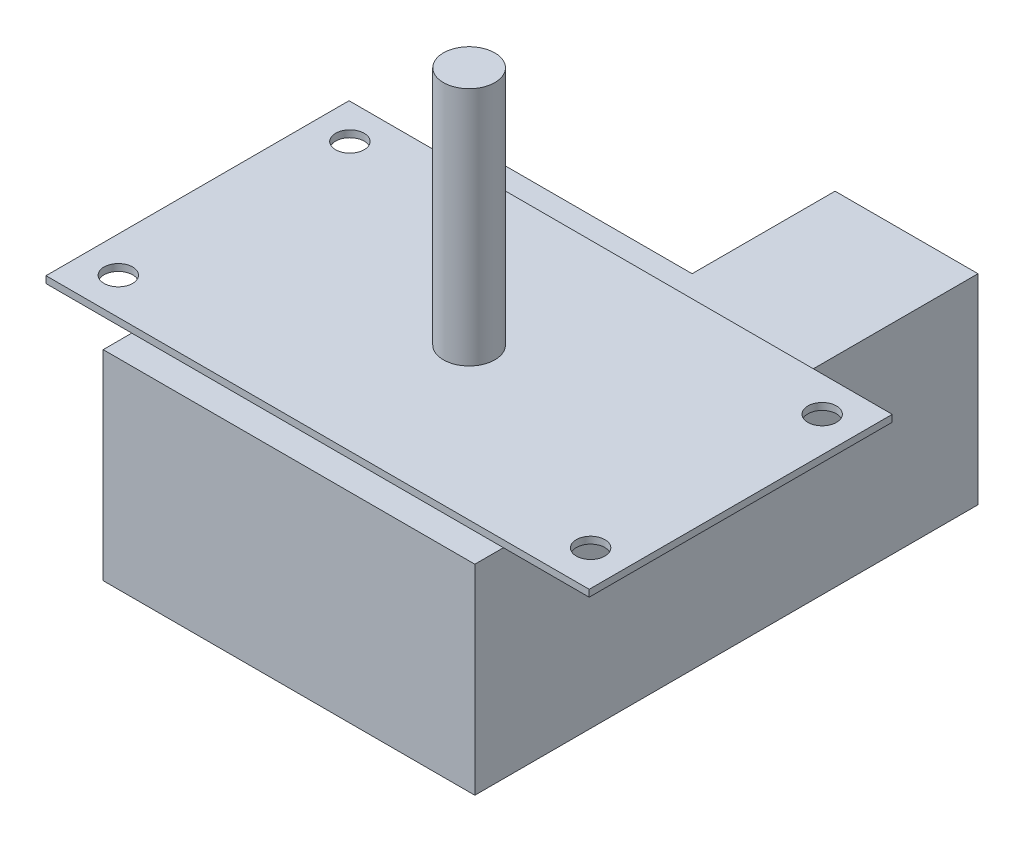
ISO-10303-21;
HEADER;
FILE_DESCRIPTION(('STEP AP214'),'2;1');
FILE_NAME('part.step','',(''),(''),'','','');
FILE_SCHEMA(('AUTOMOTIVE_DESIGN { 1 0 10303 214 1 1 1 1 }'));
ENDSEC;
DATA;
#1=APPLICATION_CONTEXT('core data for automotive mechanical design processes');
#2=APPLICATION_PROTOCOL_DEFINITION('international standard','automotive_design',2000,#1);
#3=PRODUCT_CONTEXT('',#1,'mechanical');
#4=PRODUCT('Part','Part','',(#3));
#5=PRODUCT_RELATED_PRODUCT_CATEGORY('part','',(#4));
#6=PRODUCT_DEFINITION_FORMATION('','',#4);
#7=PRODUCT_DEFINITION_CONTEXT('part definition',#1,'design');
#8=PRODUCT_DEFINITION('design','',#6,#7);
#9=PRODUCT_DEFINITION_SHAPE('','',#8);
#10=(LENGTH_UNIT() NAMED_UNIT(*) SI_UNIT(.MILLI.,.METRE.));
#11=(NAMED_UNIT(*) PLANE_ANGLE_UNIT() SI_UNIT($,.RADIAN.));
#12=(NAMED_UNIT(*) SI_UNIT($,.STERADIAN.) SOLID_ANGLE_UNIT());
#13=UNCERTAINTY_MEASURE_WITH_UNIT(LENGTH_MEASURE(1.E-05),#10,'distance_accuracy_value','');
#14=(GEOMETRIC_REPRESENTATION_CONTEXT(3) GLOBAL_UNCERTAINTY_ASSIGNED_CONTEXT((#13)) GLOBAL_UNIT_ASSIGNED_CONTEXT((#10,
#11,#12)) REPRESENTATION_CONTEXT('',''));
#15=CARTESIAN_POINT('',(0.,0.,0.));
#16=DIRECTION('',(0.,0.,1.));
#17=DIRECTION('',(1.,0.,0.));
#18=AXIS2_PLACEMENT_3D('',#15,#16,#17);
#19=CARTESIAN_POINT('',(0.,0.,0.));
#20=DIRECTION('',(0.,1.,0.));
#21=DIRECTION('',(0.,0.,1.));
#22=AXIS2_PLACEMENT_3D('',#19,#20,#21);
#23=PLANE('',#22);
#24=CARTESIAN_POINT('',(41.35,0.,20.1));
#25=DIRECTION('',(0.,1.,0.));
#26=DIRECTION('',(0.,0.,1.));
#27=AXIS2_PLACEMENT_3D('',#24,#25,#26);
#28=CIRCLE('',#27,2.5);
#29=CARTESIAN_POINT('',(41.35,0.,22.6));
#30=VERTEX_POINT('',#29);
#31=EDGE_CURVE('E166',#30,#30,#28,.F.);
#32=ORIENTED_EDGE('',*,*,#31,.F.);
#33=EDGE_LOOP('',(#32));
#34=FACE_BOUND('',#33,.T.);
#35=CARTESIAN_POINT('',(41.35,0.,-20.4));
#36=DIRECTION('',(0.,1.,0.));
#37=DIRECTION('',(0.,0.,1.));
#38=AXIS2_PLACEMENT_3D('',#35,#36,#37);
#39=CIRCLE('',#38,2.5);
#40=CARTESIAN_POINT('',(41.35,0.,-17.9));
#41=VERTEX_POINT('',#40);
#42=EDGE_CURVE('E180',#41,#41,#39,.F.);
#43=ORIENTED_EDGE('',*,*,#42,.F.);
#44=EDGE_LOOP('',(#43));
#45=FACE_BOUND('',#44,.T.);
#46=DIRECTION('',(0.,0.,1.));
#47=VECTOR('',#46,1.);
#48=CARTESIAN_POINT('',(32.5,0.,31.5));
#49=LINE('',#48,#47);
#50=CARTESIAN_POINT('',(32.5,0.,-26.5));
#51=VERTEX_POINT('',#50);
#52=CARTESIAN_POINT('',(32.5,0.,26.5));
#53=VERTEX_POINT('',#52);
#54=EDGE_CURVE('E11',#51,#53,#49,.T.);
#55=ORIENTED_EDGE('',*,*,#54,.F.);
#56=DIRECTION('',(1.,0.,0.));
#57=VECTOR('',#56,1.);
#58=CARTESIAN_POINT('',(-47.5,0.,-26.5));
#59=LINE('',#58,#57);
#60=CARTESIAN_POINT('',(47.5,0.,-26.5));
#61=VERTEX_POINT('',#60);
#62=EDGE_CURVE('E199',#51,#61,#59,.T.);
#63=ORIENTED_EDGE('',*,*,#62,.T.);
#64=DIRECTION('',(0.,0.,-1.));
#65=VECTOR('',#64,1.);
#66=CARTESIAN_POINT('',(47.5,0.,26.5));
#67=LINE('',#66,#65);
#68=CARTESIAN_POINT('',(47.5,0.,26.5));
#69=VERTEX_POINT('',#68);
#70=EDGE_CURVE('E218',#69,#61,#67,.T.);
#71=ORIENTED_EDGE('',*,*,#70,.F.);
#72=DIRECTION('',(1.,0.,0.));
#73=VECTOR('',#72,1.);
#74=CARTESIAN_POINT('',(-47.5,0.,26.5));
#75=LINE('',#74,#73);
#76=EDGE_CURVE('E59',#53,#69,#75,.T.);
#77=ORIENTED_EDGE('',*,*,#76,.F.);
#78=EDGE_LOOP('',(#55,#63,#71,#77));
#79=FACE_BOUND('',#78,.T.);
#80=ADVANCED_FACE('F39',(#34,#45,#79),#23,.F.);
#81=CARTESIAN_POINT('',(-41.25,0.,-20.4));
#82=DIRECTION('',(0.,1.,0.));
#83=DIRECTION('',(0.,0.,1.));
#84=AXIS2_PLACEMENT_3D('',#81,#82,#83);
#85=CIRCLE('',#84,2.5);
#86=CARTESIAN_POINT('',(-41.25,0.,-17.9));
#87=VERTEX_POINT('',#86);
#88=EDGE_CURVE('E195',#87,#87,#85,.F.);
#89=ORIENTED_EDGE('',*,*,#88,.F.);
#90=EDGE_LOOP('',(#89));
#91=FACE_BOUND('',#90,.T.);
#92=CARTESIAN_POINT('',(-41.25,0.,20.1));
#93=DIRECTION('',(0.,1.,0.));
#94=DIRECTION('',(0.,0.,1.));
#95=AXIS2_PLACEMENT_3D('',#92,#93,#94);
#96=CIRCLE('',#95,2.5);
#97=CARTESIAN_POINT('',(-41.25,0.,22.6));
#98=VERTEX_POINT('',#97);
#99=EDGE_CURVE('E181',#98,#98,#96,.F.);
#100=ORIENTED_EDGE('',*,*,#99,.F.);
#101=EDGE_LOOP('',(#100));
#102=FACE_BOUND('',#101,.T.);
#103=DIRECTION('',(0.,0.,-1.));
#104=VECTOR('',#103,1.);
#105=CARTESIAN_POINT('',(-32.5,0.,-31.5));
#106=LINE('',#105,#104);
#107=CARTESIAN_POINT('',(-32.5,0.,26.5));
#108=VERTEX_POINT('',#107);
#109=CARTESIAN_POINT('',(-32.5,0.,-26.5));
#110=VERTEX_POINT('',#109);
#111=EDGE_CURVE('E49',#108,#110,#106,.T.);
#112=ORIENTED_EDGE('',*,*,#111,.F.);
#113=CARTESIAN_POINT('',(-47.5,0.,26.5));
#114=VERTEX_POINT('',#113);
#115=EDGE_CURVE('E223',#114,#108,#75,.T.);
#116=ORIENTED_EDGE('',*,*,#115,.F.);
#117=DIRECTION('',(0.,0.,-1.));
#118=VECTOR('',#117,1.);
#119=CARTESIAN_POINT('',(-47.5,0.,26.5));
#120=LINE('',#119,#118);
#121=CARTESIAN_POINT('',(-47.5,0.,-26.5));
#122=VERTEX_POINT('',#121);
#123=EDGE_CURVE('E205',#114,#122,#120,.T.);
#124=ORIENTED_EDGE('',*,*,#123,.T.);
#125=EDGE_CURVE('E215',#122,#110,#59,.T.);
#126=ORIENTED_EDGE('',*,*,#125,.T.);
#127=EDGE_LOOP('',(#112,#116,#124,#126));
#128=FACE_BOUND('',#127,.T.);
#129=ADVANCED_FACE('F369',(#91,#102,#128),#23,.F.);
#130=CARTESIAN_POINT('',(-47.5,1.2,-26.5));
#131=DIRECTION('',(0.,0.,-1.));
#132=DIRECTION('',(-1.,0.,0.));
#133=AXIS2_PLACEMENT_3D('',#130,#131,#132);
#134=PLANE('',#133);
#135=ORIENTED_EDGE('',*,*,#125,.F.);
#136=DIRECTION('',(0.,-1.,0.));
#137=VECTOR('',#136,1.);
#138=CARTESIAN_POINT('',(-47.5,1.2,-26.5));
#139=LINE('',#138,#137);
#140=CARTESIAN_POINT('',(-47.5,1.2,-26.5));
#141=VERTEX_POINT('',#140);
#142=EDGE_CURVE('E230',#141,#122,#139,.T.);
#143=ORIENTED_EDGE('',*,*,#142,.F.);
#144=DIRECTION('',(1.,0.,0.));
#145=VECTOR('',#144,1.);
#146=CARTESIAN_POINT('',(-47.5,1.2,-26.5));
#147=LINE('',#146,#145);
#148=CARTESIAN_POINT('',(47.5,1.2,-26.5));
#149=VERTEX_POINT('',#148);
#150=EDGE_CURVE('E200',#141,#149,#147,.T.);
#151=ORIENTED_EDGE('',*,*,#150,.T.);
#152=DIRECTION('',(0.,-1.,0.));
#153=VECTOR('',#152,1.);
#154=CARTESIAN_POINT('',(47.5,1.2,-26.5));
#155=LINE('',#154,#153);
#156=EDGE_CURVE('E43',#149,#61,#155,.T.);
#157=ORIENTED_EDGE('',*,*,#156,.T.);
#158=ORIENTED_EDGE('',*,*,#62,.F.);
#159=EDGE_CURVE('E219',#110,#51,#59,.T.);
#160=ORIENTED_EDGE('',*,*,#159,.F.);
#161=EDGE_LOOP('',(#135,#143,#151,#157,#158,#160));
#162=FACE_BOUND('',#161,.T.);
#163=ADVANCED_FACE('F41',(#162),#134,.T.);
#164=CARTESIAN_POINT('',(-47.5,1.2,26.5));
#165=DIRECTION('',(-1.,0.,0.));
#166=DIRECTION('',(0.,0.,1.));
#167=AXIS2_PLACEMENT_3D('',#164,#165,#166);
#168=PLANE('',#167);
#169=ORIENTED_EDGE('',*,*,#123,.F.);
#170=DIRECTION('',(0.,-1.,0.));
#171=VECTOR('',#170,1.);
#172=CARTESIAN_POINT('',(-47.5,1.2,26.5));
#173=LINE('',#172,#171);
#174=CARTESIAN_POINT('',(-47.5,1.2,26.5));
#175=VERTEX_POINT('',#174);
#176=EDGE_CURVE('E233',#175,#114,#173,.T.);
#177=ORIENTED_EDGE('',*,*,#176,.F.);
#178=DIRECTION('',(0.,0.,-1.));
#179=VECTOR('',#178,1.);
#180=CARTESIAN_POINT('',(-47.5,1.2,26.5));
#181=LINE('',#180,#179);
#182=EDGE_CURVE('E211',#175,#141,#181,.T.);
#183=ORIENTED_EDGE('',*,*,#182,.T.);
#184=ORIENTED_EDGE('',*,*,#142,.T.);
#185=EDGE_LOOP('',(#169,#177,#183,#184));
#186=FACE_BOUND('',#185,.T.);
#187=ADVANCED_FACE('F347',(#186),#168,.T.);
#188=CARTESIAN_POINT('',(-47.5,1.2,26.5));
#189=DIRECTION('',(0.,0.,-1.));
#190=DIRECTION('',(-1.,0.,0.));
#191=AXIS2_PLACEMENT_3D('',#188,#189,#190);
#192=PLANE('',#191);
#193=ORIENTED_EDGE('',*,*,#115,.T.);
#194=EDGE_CURVE('E226',#108,#53,#75,.T.);
#195=ORIENTED_EDGE('',*,*,#194,.T.);
#196=ORIENTED_EDGE('',*,*,#76,.T.);
#197=DIRECTION('',(0.,-1.,0.));
#198=VECTOR('',#197,1.);
#199=CARTESIAN_POINT('',(47.5,1.2,26.5));
#200=LINE('',#199,#198);
#201=CARTESIAN_POINT('',(47.5,1.2,26.5));
#202=VERTEX_POINT('',#201);
#203=EDGE_CURVE('E235',#202,#69,#200,.T.);
#204=ORIENTED_EDGE('',*,*,#203,.F.);
#205=DIRECTION('',(1.,0.,0.));
#206=VECTOR('',#205,1.);
#207=CARTESIAN_POINT('',(-47.5,1.2,26.5));
#208=LINE('',#207,#206);
#209=EDGE_CURVE('E208',#175,#202,#208,.T.);
#210=ORIENTED_EDGE('',*,*,#209,.F.);
#211=ORIENTED_EDGE('',*,*,#176,.T.);
#212=EDGE_LOOP('',(#193,#195,#196,#204,#210,#211));
#213=FACE_BOUND('',#212,.T.);
#214=ADVANCED_FACE('F350',(#213),#192,.F.);
#215=CARTESIAN_POINT('',(47.5,1.2,26.5));
#216=DIRECTION('',(-1.,0.,0.));
#217=DIRECTION('',(0.,0.,1.));
#218=AXIS2_PLACEMENT_3D('',#215,#216,#217);
#219=PLANE('',#218);
#220=ORIENTED_EDGE('',*,*,#70,.T.);
#221=ORIENTED_EDGE('',*,*,#156,.F.);
#222=DIRECTION('',(0.,0.,-1.));
#223=VECTOR('',#222,1.);
#224=CARTESIAN_POINT('',(47.5,1.2,26.5));
#225=LINE('',#224,#223);
#226=EDGE_CURVE('E204',#202,#149,#225,.T.);
#227=ORIENTED_EDGE('',*,*,#226,.F.);
#228=ORIENTED_EDGE('',*,*,#203,.T.);
#229=EDGE_LOOP('',(#220,#221,#227,#228));
#230=FACE_BOUND('',#229,.T.);
#231=ADVANCED_FACE('F250',(#230),#219,.F.);
#232=CARTESIAN_POINT('',(0.,1.2,0.));
#233=DIRECTION('',(0.,1.,0.));
#234=DIRECTION('',(0.,0.,1.));
#235=AXIS2_PLACEMENT_3D('',#232,#233,#234);
#236=PLANE('',#235);
#237=CARTESIAN_POINT('',(0.,1.2,0.));
#238=DIRECTION('',(0.,1.,0.));
#239=DIRECTION('',(0.,0.,1.));
#240=AXIS2_PLACEMENT_3D('',#237,#238,#239);
#241=CIRCLE('',#240,4.5);
#242=CARTESIAN_POINT('',(0.,1.2,-4.5));
#243=VERTEX_POINT('',#242);
#244=EDGE_CURVE('E315',#243,#243,#241,.T.);
#245=ORIENTED_EDGE('',*,*,#244,.F.);
#246=EDGE_LOOP('',(#245));
#247=FACE_BOUND('',#246,.T.);
#248=CARTESIAN_POINT('',(41.35,1.2,-20.4));
#249=DIRECTION('',(0.,1.,0.));
#250=DIRECTION('',(0.,0.,1.));
#251=AXIS2_PLACEMENT_3D('',#248,#249,#250);
#252=CIRCLE('',#251,2.5);
#253=CARTESIAN_POINT('',(41.35,1.2,-17.9));
#254=VERTEX_POINT('',#253);
#255=EDGE_CURVE('E176',#254,#254,#252,.T.);
#256=ORIENTED_EDGE('',*,*,#255,.F.);
#257=EDGE_LOOP('',(#256));
#258=FACE_BOUND('',#257,.T.);
#259=CARTESIAN_POINT('',(-41.25,1.2,20.1));
#260=DIRECTION('',(0.,1.,0.));
#261=DIRECTION('',(0.,0.,1.));
#262=AXIS2_PLACEMENT_3D('',#259,#260,#261);
#263=CIRCLE('',#262,2.5);
#264=CARTESIAN_POINT('',(-41.25,1.2,22.6));
#265=VERTEX_POINT('',#264);
#266=EDGE_CURVE('E175',#265,#265,#263,.T.);
#267=ORIENTED_EDGE('',*,*,#266,.F.);
#268=EDGE_LOOP('',(#267));
#269=FACE_BOUND('',#268,.T.);
#270=CARTESIAN_POINT('',(41.35,1.2,20.1));
#271=DIRECTION('',(0.,1.,0.));
#272=DIRECTION('',(0.,0.,1.));
#273=AXIS2_PLACEMENT_3D('',#270,#271,#272);
#274=CIRCLE('',#273,2.5);
#275=CARTESIAN_POINT('',(41.35,1.2,22.6));
#276=VERTEX_POINT('',#275);
#277=EDGE_CURVE('E161',#276,#276,#274,.T.);
#278=ORIENTED_EDGE('',*,*,#277,.F.);
#279=EDGE_LOOP('',(#278));
#280=FACE_BOUND('',#279,.T.);
#281=CARTESIAN_POINT('',(-41.25,1.2,-20.4));
#282=DIRECTION('',(0.,1.,0.));
#283=DIRECTION('',(0.,0.,1.));
#284=AXIS2_PLACEMENT_3D('',#281,#282,#283);
#285=CIRCLE('',#284,2.5);
#286=CARTESIAN_POINT('',(-41.25,1.2,-17.9));
#287=VERTEX_POINT('',#286);
#288=EDGE_CURVE('E185',#287,#287,#285,.T.);
#289=ORIENTED_EDGE('',*,*,#288,.F.);
#290=EDGE_LOOP('',(#289));
#291=FACE_BOUND('',#290,.T.);
#292=ORIENTED_EDGE('',*,*,#150,.F.);
#293=ORIENTED_EDGE('',*,*,#182,.F.);
#294=ORIENTED_EDGE('',*,*,#209,.T.);
#295=ORIENTED_EDGE('',*,*,#226,.T.);
#296=EDGE_LOOP('',(#292,#293,#294,#295));
#297=FACE_BOUND('',#296,.T.);
#298=ADVANCED_FACE('F331',(#247,#258,#269,#280,#291,#297),#236,.T.);
#299=CARTESIAN_POINT('',(-41.25,-0.000999999999999916,-20.4));
#300=DIRECTION('',(0.,1.,0.));
#301=DIRECTION('',(0.,0.,1.));
#302=AXIS2_PLACEMENT_3D('',#299,#300,#301);
#303=CYLINDRICAL_SURFACE('',#302,2.5);
#304=ORIENTED_EDGE('',*,*,#288,.T.);
#305=EDGE_LOOP('',(#304));
#306=FACE_BOUND('',#305,.T.);
#307=ORIENTED_EDGE('',*,*,#88,.T.);
#308=EDGE_LOOP('',(#307));
#309=FACE_BOUND('',#308,.T.);
#310=ADVANCED_FACE('F334',(#306,#309),#303,.F.);
#311=CARTESIAN_POINT('',(41.35,-0.000999999999999916,20.1));
#312=DIRECTION('',(0.,1.,0.));
#313=DIRECTION('',(0.,0.,1.));
#314=AXIS2_PLACEMENT_3D('',#311,#312,#313);
#315=CYLINDRICAL_SURFACE('',#314,2.5);
#316=ORIENTED_EDGE('',*,*,#277,.T.);
#317=EDGE_LOOP('',(#316));
#318=FACE_BOUND('',#317,.T.);
#319=ORIENTED_EDGE('',*,*,#31,.T.);
#320=EDGE_LOOP('',(#319));
#321=FACE_BOUND('',#320,.T.);
#322=ADVANCED_FACE('F401',(#318,#321),#315,.F.);
#323=CARTESIAN_POINT('',(-41.25,-0.000999999999999916,20.1));
#324=DIRECTION('',(0.,1.,0.));
#325=DIRECTION('',(0.,0.,1.));
#326=AXIS2_PLACEMENT_3D('',#323,#324,#325);
#327=CYLINDRICAL_SURFACE('',#326,2.5);
#328=ORIENTED_EDGE('',*,*,#266,.T.);
#329=EDGE_LOOP('',(#328));
#330=FACE_BOUND('',#329,.T.);
#331=ORIENTED_EDGE('',*,*,#99,.T.);
#332=EDGE_LOOP('',(#331));
#333=FACE_BOUND('',#332,.T.);
#334=ADVANCED_FACE('F408',(#330,#333),#327,.F.);
#335=CARTESIAN_POINT('',(41.35,-0.000999999999999916,-20.4));
#336=DIRECTION('',(0.,1.,0.));
#337=DIRECTION('',(0.,0.,1.));
#338=AXIS2_PLACEMENT_3D('',#335,#336,#337);
#339=CYLINDRICAL_SURFACE('',#338,2.5);
#340=ORIENTED_EDGE('',*,*,#255,.T.);
#341=EDGE_LOOP('',(#340));
#342=FACE_BOUND('',#341,.T.);
#343=ORIENTED_EDGE('',*,*,#42,.T.);
#344=EDGE_LOOP('',(#343));
#345=FACE_BOUND('',#344,.T.);
#346=ADVANCED_FACE('F416',(#342,#345),#339,.F.);
#347=CARTESIAN_POINT('',(0.,0.,0.));
#348=DIRECTION('',(0.,1.,0.));
#349=DIRECTION('',(0.,0.,1.));
#350=AXIS2_PLACEMENT_3D('',#347,#348,#349);
#351=PLANE('',#350);
#352=ORIENTED_EDGE('',*,*,#194,.F.);
#353=CARTESIAN_POINT('',(-32.5,0.,31.5));
#354=VERTEX_POINT('',#353);
#355=EDGE_CURVE('E270',#354,#108,#106,.T.);
#356=ORIENTED_EDGE('',*,*,#355,.F.);
#357=DIRECTION('',(-1.,0.,0.));
#358=VECTOR('',#357,1.);
#359=CARTESIAN_POINT('',(-32.5,0.,31.5));
#360=LINE('',#359,#358);
#361=CARTESIAN_POINT('',(32.5,0.,31.5));
#362=VERTEX_POINT('',#361);
#363=EDGE_CURVE('E262',#362,#354,#360,.T.);
#364=ORIENTED_EDGE('',*,*,#363,.F.);
#365=EDGE_CURVE('E52',#53,#362,#49,.T.);
#366=ORIENTED_EDGE('',*,*,#365,.F.);
#367=EDGE_LOOP('',(#352,#356,#364,#366));
#368=FACE_BOUND('',#367,.T.);
#369=ADVANCED_FACE('F356',(#368),#351,.T.);
#370=CARTESIAN_POINT('',(32.5,-35.,31.5));
#371=DIRECTION('',(-1.,0.,0.));
#372=DIRECTION('',(0.,0.,1.));
#373=AXIS2_PLACEMENT_3D('',#370,#371,#372);
#374=PLANE('',#373);
#375=CARTESIAN_POINT('',(32.5,0.,-56.5));
#376=VERTEX_POINT('',#375);
#377=EDGE_CURVE('E51',#376,#51,#49,.T.);
#378=ORIENTED_EDGE('',*,*,#377,.T.);
#379=ORIENTED_EDGE('',*,*,#54,.T.);
#380=ORIENTED_EDGE('',*,*,#365,.T.);
#381=DIRECTION('',(0.,1.,0.));
#382=VECTOR('',#381,1.);
#383=CARTESIAN_POINT('',(32.5,-35.,31.5));
#384=LINE('',#383,#382);
#385=CARTESIAN_POINT('',(32.5,-35.,31.5));
#386=VERTEX_POINT('',#385);
#387=EDGE_CURVE('E137',#386,#362,#384,.T.);
#388=ORIENTED_EDGE('',*,*,#387,.F.);
#389=DIRECTION('',(0.,0.,1.));
#390=VECTOR('',#389,1.);
#391=CARTESIAN_POINT('',(32.5,-35.,31.5));
#392=LINE('',#391,#390);
#393=CARTESIAN_POINT('',(32.5,-35.,-56.5));
#394=VERTEX_POINT('',#393);
#395=EDGE_CURVE('E144',#394,#386,#392,.T.);
#396=ORIENTED_EDGE('',*,*,#395,.F.);
#397=DIRECTION('',(0.,1.,0.));
#398=VECTOR('',#397,1.);
#399=CARTESIAN_POINT('',(32.5,-35.,-56.5));
#400=LINE('',#399,#398);
#401=EDGE_CURVE('E260',#394,#376,#400,.T.);
#402=ORIENTED_EDGE('',*,*,#401,.T.);
#403=EDGE_LOOP('',(#378,#379,#380,#388,#396,#402));
#404=FACE_BOUND('',#403,.T.);
#405=ADVANCED_FACE('F157',(#404),#374,.F.);
#406=CARTESIAN_POINT('',(-32.5,-35.,31.5));
#407=DIRECTION('',(0.,0.,-1.));
#408=DIRECTION('',(-1.,0.,0.));
#409=AXIS2_PLACEMENT_3D('',#406,#407,#408);
#410=PLANE('',#409);
#411=ORIENTED_EDGE('',*,*,#363,.T.);
#412=DIRECTION('',(0.,1.,0.));
#413=VECTOR('',#412,1.);
#414=CARTESIAN_POINT('',(-32.5,-35.,31.5));
#415=LINE('',#414,#413);
#416=CARTESIAN_POINT('',(-32.5,-35.,31.5));
#417=VERTEX_POINT('',#416);
#418=EDGE_CURVE('E139',#417,#354,#415,.T.);
#419=ORIENTED_EDGE('',*,*,#418,.F.);
#420=DIRECTION('',(-1.,0.,0.));
#421=VECTOR('',#420,1.);
#422=CARTESIAN_POINT('',(-32.5,-35.,31.5));
#423=LINE('',#422,#421);
#424=EDGE_CURVE('E133',#386,#417,#423,.T.);
#425=ORIENTED_EDGE('',*,*,#424,.F.);
#426=ORIENTED_EDGE('',*,*,#387,.T.);
#427=EDGE_LOOP('',(#411,#419,#425,#426));
#428=FACE_BOUND('',#427,.T.);
#429=ADVANCED_FACE('F135',(#428),#410,.F.);
#430=CARTESIAN_POINT('',(-32.5,-35.,-31.5));
#431=DIRECTION('',(1.,0.,0.));
#432=DIRECTION('',(0.,0.,-1.));
#433=AXIS2_PLACEMENT_3D('',#430,#431,#432);
#434=PLANE('',#433);
#435=ORIENTED_EDGE('',*,*,#355,.T.);
#436=ORIENTED_EDGE('',*,*,#111,.T.);
#437=CARTESIAN_POINT('',(-32.5,0.,-31.5));
#438=VERTEX_POINT('',#437);
#439=EDGE_CURVE('E259',#110,#438,#106,.T.);
#440=ORIENTED_EDGE('',*,*,#439,.T.);
#441=DIRECTION('',(0.,1.,0.));
#442=VECTOR('',#441,1.);
#443=CARTESIAN_POINT('',(-32.5,-35.,-31.5));
#444=LINE('',#443,#442);
#445=CARTESIAN_POINT('',(-32.5,-35.,-31.5));
#446=VERTEX_POINT('',#445);
#447=EDGE_CURVE('E168',#446,#438,#444,.T.);
#448=ORIENTED_EDGE('',*,*,#447,.F.);
#449=DIRECTION('',(0.,0.,-1.));
#450=VECTOR('',#449,1.);
#451=CARTESIAN_POINT('',(-32.5,-35.,-31.5));
#452=LINE('',#451,#450);
#453=EDGE_CURVE('E143',#417,#446,#452,.T.);
#454=ORIENTED_EDGE('',*,*,#453,.F.);
#455=ORIENTED_EDGE('',*,*,#418,.T.);
#456=EDGE_LOOP('',(#435,#436,#440,#448,#454,#455));
#457=FACE_BOUND('',#456,.T.);
#458=ADVANCED_FACE('F357',(#457),#434,.F.);
#459=CARTESIAN_POINT('',(7.49999999999999,-35.,-31.5));
#460=DIRECTION('',(0.,0.,1.));
#461=DIRECTION('',(1.,0.,0.));
#462=AXIS2_PLACEMENT_3D('',#459,#460,#461);
#463=PLANE('',#462);
#464=DIRECTION('',(1.,0.,0.));
#465=VECTOR('',#464,1.);
#466=CARTESIAN_POINT('',(7.49999999999999,0.,-31.5));
#467=LINE('',#466,#465);
#468=CARTESIAN_POINT('',(7.49999999999999,0.,-31.5));
#469=VERTEX_POINT('',#468);
#470=EDGE_CURVE('E274',#438,#469,#467,.T.);
#471=ORIENTED_EDGE('',*,*,#470,.T.);
#472=DIRECTION('',(0.,1.,0.));
#473=VECTOR('',#472,1.);
#474=CARTESIAN_POINT('',(7.49999999999999,-35.,-31.5));
#475=LINE('',#474,#473);
#476=CARTESIAN_POINT('',(7.49999999999999,-35.,-31.5));
#477=VERTEX_POINT('',#476);
#478=EDGE_CURVE('E288',#477,#469,#475,.T.);
#479=ORIENTED_EDGE('',*,*,#478,.F.);
#480=DIRECTION('',(1.,0.,0.));
#481=VECTOR('',#480,1.);
#482=CARTESIAN_POINT('',(7.49999999999999,-35.,-31.5));
#483=LINE('',#482,#481);
#484=EDGE_CURVE('E298',#446,#477,#483,.T.);
#485=ORIENTED_EDGE('',*,*,#484,.F.);
#486=ORIENTED_EDGE('',*,*,#447,.T.);
#487=EDGE_LOOP('',(#471,#479,#485,#486));
#488=FACE_BOUND('',#487,.T.);
#489=ADVANCED_FACE('F296',(#488),#463,.F.);
#490=CARTESIAN_POINT('',(7.49999999999999,-35.,-56.5));
#491=DIRECTION('',(1.,0.,0.));
#492=DIRECTION('',(0.,0.,-1.));
#493=AXIS2_PLACEMENT_3D('',#490,#491,#492);
#494=PLANE('',#493);
#495=DIRECTION('',(0.,0.,-1.));
#496=VECTOR('',#495,1.);
#497=CARTESIAN_POINT('',(7.49999999999999,0.,-56.5));
#498=LINE('',#497,#496);
#499=CARTESIAN_POINT('',(7.49999999999999,0.,-56.5));
#500=VERTEX_POINT('',#499);
#501=EDGE_CURVE('E277',#469,#500,#498,.T.);
#502=ORIENTED_EDGE('',*,*,#501,.T.);
#503=DIRECTION('',(0.,1.,0.));
#504=VECTOR('',#503,1.);
#505=CARTESIAN_POINT('',(7.49999999999999,-35.,-56.5));
#506=LINE('',#505,#504);
#507=CARTESIAN_POINT('',(7.49999999999999,-35.,-56.5));
#508=VERTEX_POINT('',#507);
#509=EDGE_CURVE('E284',#508,#500,#506,.T.);
#510=ORIENTED_EDGE('',*,*,#509,.F.);
#511=DIRECTION('',(0.,0.,-1.));
#512=VECTOR('',#511,1.);
#513=CARTESIAN_POINT('',(7.49999999999999,-35.,-56.5));
#514=LINE('',#513,#512);
#515=EDGE_CURVE('E308',#477,#508,#514,.T.);
#516=ORIENTED_EDGE('',*,*,#515,.F.);
#517=ORIENTED_EDGE('',*,*,#478,.T.);
#518=EDGE_LOOP('',(#502,#510,#516,#517));
#519=FACE_BOUND('',#518,.T.);
#520=ADVANCED_FACE('F303',(#519),#494,.F.);
#521=CARTESIAN_POINT('',(32.5,-35.,-56.5));
#522=DIRECTION('',(0.,0.,1.));
#523=DIRECTION('',(1.,0.,0.));
#524=AXIS2_PLACEMENT_3D('',#521,#522,#523);
#525=PLANE('',#524);
#526=DIRECTION('',(1.,0.,0.));
#527=VECTOR('',#526,1.);
#528=CARTESIAN_POINT('',(32.5,0.,-56.5));
#529=LINE('',#528,#527);
#530=EDGE_CURVE('E154',#500,#376,#529,.T.);
#531=ORIENTED_EDGE('',*,*,#530,.T.);
#532=ORIENTED_EDGE('',*,*,#401,.F.);
#533=DIRECTION('',(1.,0.,0.));
#534=VECTOR('',#533,1.);
#535=CARTESIAN_POINT('',(32.5,-35.,-56.5));
#536=LINE('',#535,#534);
#537=EDGE_CURVE('E149',#508,#394,#536,.T.);
#538=ORIENTED_EDGE('',*,*,#537,.F.);
#539=ORIENTED_EDGE('',*,*,#509,.T.);
#540=EDGE_LOOP('',(#531,#532,#538,#539));
#541=FACE_BOUND('',#540,.T.);
#542=ADVANCED_FACE('F306',(#541),#525,.F.);
#543=CARTESIAN_POINT('',(0.,-35.,0.));
#544=DIRECTION('',(0.,1.,0.));
#545=DIRECTION('',(0.,0.,1.));
#546=AXIS2_PLACEMENT_3D('',#543,#544,#545);
#547=PLANE('',#546);
#548=ORIENTED_EDGE('',*,*,#395,.T.);
#549=ORIENTED_EDGE('',*,*,#424,.T.);
#550=ORIENTED_EDGE('',*,*,#453,.T.);
#551=ORIENTED_EDGE('',*,*,#484,.T.);
#552=ORIENTED_EDGE('',*,*,#515,.T.);
#553=ORIENTED_EDGE('',*,*,#537,.T.);
#554=EDGE_LOOP('',(#548,#549,#550,#551,#552,#553));
#555=FACE_BOUND('',#554,.T.);
#556=ADVANCED_FACE('F147',(#555),#547,.F.);
#557=ORIENTED_EDGE('',*,*,#439,.F.);
#558=ORIENTED_EDGE('',*,*,#159,.T.);
#559=ORIENTED_EDGE('',*,*,#377,.F.);
#560=ORIENTED_EDGE('',*,*,#530,.F.);
#561=ORIENTED_EDGE('',*,*,#501,.F.);
#562=ORIENTED_EDGE('',*,*,#470,.F.);
#563=EDGE_LOOP('',(#557,#558,#559,#560,#561,#562));
#564=FACE_BOUND('',#563,.T.);
#565=ADVANCED_FACE('F256',(#564),#351,.T.);
#566=CARTESIAN_POINT('',(0.,43.2,0.));
#567=DIRECTION('',(0.,-1.,0.));
#568=DIRECTION('',(0.,0.,-1.));
#569=AXIS2_PLACEMENT_3D('',#566,#567,#568);
#570=CYLINDRICAL_SURFACE('',#569,4.5);
#571=CARTESIAN_POINT('',(0.,43.2,0.));
#572=DIRECTION('',(0.,1.,0.));
#573=DIRECTION('',(0.,0.,1.));
#574=AXIS2_PLACEMENT_3D('',#571,#572,#573);
#575=CIRCLE('',#574,4.5);
#576=CARTESIAN_POINT('',(0.,43.2,-4.5));
#577=VERTEX_POINT('',#576);
#578=EDGE_CURVE('E266',#577,#577,#575,.T.);
#579=CARTESIAN_POINT('',(0.,43.2,-4.5));
#580=CARTESIAN_POINT('',(0.,42.7625,-4.5));
#581=CARTESIAN_POINT('',(0.,42.325,-4.5));
#582=CARTESIAN_POINT('',(0.,41.45,-4.5));
#583=CARTESIAN_POINT('',(0.,41.0125,-4.5));
#584=CARTESIAN_POINT('',(0.,40.1375,-4.5));
#585=CARTESIAN_POINT('',(0.,39.7,-4.5));
#586=CARTESIAN_POINT('',(0.,38.825,-4.5));
#587=CARTESIAN_POINT('',(0.,38.3875,-4.5));
#588=CARTESIAN_POINT('',(0.,37.5125,-4.5));
#589=CARTESIAN_POINT('',(0.,37.075,-4.5));
#590=CARTESIAN_POINT('',(0.,36.2,-4.5));
#591=CARTESIAN_POINT('',(0.,35.7625,-4.5));
#592=CARTESIAN_POINT('',(0.,34.8875,-4.5));
#593=CARTESIAN_POINT('',(0.,34.45,-4.5));
#594=CARTESIAN_POINT('',(0.,33.575,-4.5));
#595=CARTESIAN_POINT('',(0.,33.1375,-4.5));
#596=CARTESIAN_POINT('',(0.,32.2625,-4.5));
#597=CARTESIAN_POINT('',(0.,31.825,-4.5));
#598=CARTESIAN_POINT('',(0.,30.95,-4.5));
#599=CARTESIAN_POINT('',(0.,30.5125,-4.5));
#600=CARTESIAN_POINT('',(0.,29.6375,-4.5));
#601=CARTESIAN_POINT('',(0.,29.2,-4.5));
#602=CARTESIAN_POINT('',(0.,28.325,-4.5));
#603=CARTESIAN_POINT('',(0.,27.8875,-4.5));
#604=CARTESIAN_POINT('',(0.,27.0125,-4.5));
#605=CARTESIAN_POINT('',(0.,26.575,-4.5));
#606=CARTESIAN_POINT('',(0.,25.7,-4.5));
#607=CARTESIAN_POINT('',(0.,25.2625,-4.5));
#608=CARTESIAN_POINT('',(0.,24.3875,-4.5));
#609=CARTESIAN_POINT('',(0.,23.95,-4.5));
#610=CARTESIAN_POINT('',(0.,23.075,-4.5));
#611=CARTESIAN_POINT('',(0.,22.6375,-4.5));
#612=CARTESIAN_POINT('',(0.,21.7625,-4.5));
#613=CARTESIAN_POINT('',(0.,21.325,-4.5));
#614=CARTESIAN_POINT('',(0.,20.45,-4.5));
#615=CARTESIAN_POINT('',(0.,20.0125,-4.5));
#616=CARTESIAN_POINT('',(0.,19.1375,-4.5));
#617=CARTESIAN_POINT('',(0.,18.7,-4.5));
#618=CARTESIAN_POINT('',(0.,17.825,-4.5));
#619=CARTESIAN_POINT('',(0.,17.3875,-4.5));
#620=CARTESIAN_POINT('',(0.,16.5125,-4.5));
#621=CARTESIAN_POINT('',(0.,16.075,-4.5));
#622=CARTESIAN_POINT('',(0.,15.2,-4.5));
#623=CARTESIAN_POINT('',(0.,14.7625,-4.5));
#624=CARTESIAN_POINT('',(0.,13.8875,-4.5));
#625=CARTESIAN_POINT('',(0.,13.45,-4.5));
#626=CARTESIAN_POINT('',(0.,12.575,-4.5));
#627=CARTESIAN_POINT('',(0.,12.1375,-4.5));
#628=CARTESIAN_POINT('',(0.,11.2625,-4.5));
#629=CARTESIAN_POINT('',(0.,10.825,-4.5));
#630=CARTESIAN_POINT('',(0.,9.95,-4.5));
#631=CARTESIAN_POINT('',(0.,9.5125,-4.5));
#632=CARTESIAN_POINT('',(0.,8.6375,-4.5));
#633=CARTESIAN_POINT('',(0.,8.2,-4.5));
#634=CARTESIAN_POINT('',(0.,7.325,-4.5));
#635=CARTESIAN_POINT('',(0.,6.8875,-4.5));
#636=CARTESIAN_POINT('',(0.,6.0125,-4.5));
#637=CARTESIAN_POINT('',(0.,5.575,-4.5));
#638=CARTESIAN_POINT('',(0.,4.7,-4.5));
#639=CARTESIAN_POINT('',(0.,4.2625,-4.5));
#640=CARTESIAN_POINT('',(0.,3.3875,-4.5));
#641=CARTESIAN_POINT('',(0.,2.95,-4.5));
#642=CARTESIAN_POINT('',(0.,2.075,-4.5));
#643=CARTESIAN_POINT('',(0.,1.6375,-4.5));
#644=CARTESIAN_POINT('',(0.,1.2,-4.5));
#645=B_SPLINE_CURVE_WITH_KNOTS('',3,(#579,#580,#581,#582,#583,#584,#585,#586,#587,#588,#589,
#590,#591,#592,#593,#594,#595,#596,#597,#598,#599,#600,#601,#602,#603,#604,#605,#606,#607,#608,
#609,#610,#611,#612,#613,#614,#615,#616,#617,#618,#619,#620,#621,#622,#623,#624,#625,#626,#627,
#628,#629,#630,#631,#632,#633,#634,#635,#636,#637,#638,#639,#640,#641,#642,#643,#644),
.UNSPECIFIED.,.F.,.F.,(4,2,2,2,2,2,2,2,2,2,2,2,2,2,2,2,2,2,2,2,2,2,2,2,2,2,2,2,2,2,2,2,4),(0.,
1.31249999999999,2.625,3.9375,5.25,6.5625,7.87499999999999,9.18749999999999,10.5,11.8125,13.125,
14.4375,15.75,17.0625,18.375,19.6875,21.,22.3125,23.625,24.9375,26.25,27.5625,28.875,30.1875,
31.5,32.8125,34.125,35.4375,36.75,38.0625,39.375,40.6875,42.),.UNSPECIFIED.);
#646=EDGE_CURVE('BSEAM325',#577,#243,#645,.T.);
#647=ORIENTED_EDGE('',*,*,#578,.F.);
#648=ORIENTED_EDGE('',*,*,#244,.T.);
#649=ORIENTED_EDGE('',*,*,#646,.T.);
#650=ORIENTED_EDGE('',*,*,#646,.F.);
#651=EDGE_LOOP('',(#647,#649,#648,#650));
#652=FACE_BOUND('',#651,.T.);
#653=ADVANCED_FACE('F325',(#652),#570,.T.);
#654=CARTESIAN_POINT('',(0.,43.2,0.));
#655=DIRECTION('',(0.,1.,0.));
#656=DIRECTION('',(0.,0.,1.));
#657=AXIS2_PLACEMENT_3D('',#654,#655,#656);
#658=PLANE('',#657);
#659=ORIENTED_EDGE('',*,*,#578,.T.);
#660=EDGE_LOOP('',(#659));
#661=FACE_BOUND('',#660,.T.);
#662=ADVANCED_FACE('F323',(#661),#658,.T.);
#663=CLOSED_SHELL('',(#80,#129,#163,#187,#214,#231,#298,#310,#322,#334,#346,#369,#405,#429,#458,
#489,#520,#542,#556,#565,#653,#662));
#664=MANIFOLD_SOLID_BREP('B2',#663);
#665=ADVANCED_BREP_SHAPE_REPRESENTATION('',(#18,#664),#14);
#666=SHAPE_DEFINITION_REPRESENTATION(#9,#665);
ENDSEC;
END-ISO-10303-21;
